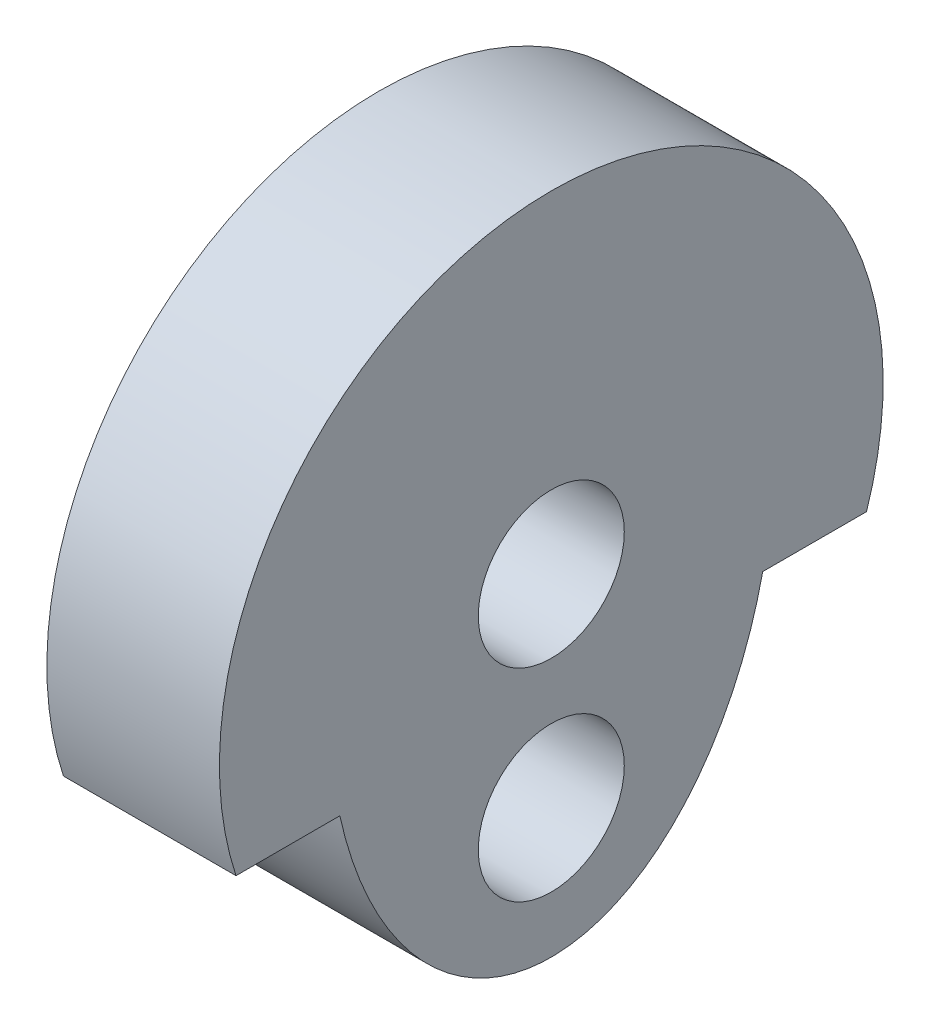
ISO-10303-21;
HEADER;
FILE_DESCRIPTION(('STEP AP214'),'2;1');
FILE_NAME('part.step','',(''),(''),'','','');
FILE_SCHEMA(('AUTOMOTIVE_DESIGN { 1 0 10303 214 1 1 1 1 }'));
ENDSEC;
DATA;
#1=APPLICATION_CONTEXT('core data for automotive mechanical design processes');
#2=APPLICATION_PROTOCOL_DEFINITION('international standard','automotive_design',2000,#1);
#3=PRODUCT_CONTEXT('',#1,'mechanical');
#4=PRODUCT('Part','Part','',(#3));
#5=PRODUCT_RELATED_PRODUCT_CATEGORY('part','',(#4));
#6=PRODUCT_DEFINITION_FORMATION('','',#4);
#7=PRODUCT_DEFINITION_CONTEXT('part definition',#1,'design');
#8=PRODUCT_DEFINITION('design','',#6,#7);
#9=PRODUCT_DEFINITION_SHAPE('','',#8);
#10=(LENGTH_UNIT() NAMED_UNIT(*) SI_UNIT(.MILLI.,.METRE.));
#11=(NAMED_UNIT(*) PLANE_ANGLE_UNIT() SI_UNIT($,.RADIAN.));
#12=(NAMED_UNIT(*) SI_UNIT($,.STERADIAN.) SOLID_ANGLE_UNIT());
#13=UNCERTAINTY_MEASURE_WITH_UNIT(LENGTH_MEASURE(1.E-05),#10,'distance_accuracy_value','');
#14=(GEOMETRIC_REPRESENTATION_CONTEXT(3) GLOBAL_UNCERTAINTY_ASSIGNED_CONTEXT((#13)) GLOBAL_UNIT_ASSIGNED_CONTEXT((#10,
#11,#12)) REPRESENTATION_CONTEXT('',''));
#15=CARTESIAN_POINT('',(0.,0.,0.));
#16=DIRECTION('',(0.,0.,1.));
#17=DIRECTION('',(1.,0.,0.));
#18=AXIS2_PLACEMENT_3D('',#15,#16,#17);
#19=CARTESIAN_POINT('',(13.,0.,0.));
#20=DIRECTION('',(1.,0.,0.));
#21=DIRECTION('',(0.,-1.,0.));
#22=AXIS2_PLACEMENT_3D('',#19,#20,#21);
#23=ELLIPSE('',#22,25.,16.7681810789173);
#24=DIRECTION('',(-1.,0.,0.));
#25=VECTOR('',#24,1.);
#26=SURFACE_OF_LINEAR_EXTRUSION('',#23,#25);
#27=CARTESIAN_POINT('',(0.,0.,0.));
#28=DIRECTION('',(1.,0.,0.));
#29=DIRECTION('',(0.,-1.,0.));
#30=AXIS2_PLACEMENT_3D('',#27,#28,#29);
#31=ELLIPSE('',#30,25.,16.7681810789173);
#32=CARTESIAN_POINT('',(0.,-7.80628379966867,15.9297640219795));
#33=VERTEX_POINT('',#32);
#34=CARTESIAN_POINT('',(0.,-7.80628379966867,-15.9297640219795));
#35=VERTEX_POINT('',#34);
#36=EDGE_CURVE('E107',#33,#35,#31,.T.);
#37=ORIENTED_EDGE('',*,*,#36,.T.);
#38=DIRECTION('',(-1.,0.,0.));
#39=VECTOR('',#38,1.);
#40=CARTESIAN_POINT('',(13.,-7.80628379966867,-15.9297640219795));
#41=LINE('',#40,#39);
#42=CARTESIAN_POINT('',(13.,-7.80628379966867,-15.9297640219795));
#43=VERTEX_POINT('',#42);
#44=EDGE_CURVE('E11',#43,#35,#41,.T.);
#45=ORIENTED_EDGE('',*,*,#44,.F.);
#46=CARTESIAN_POINT('',(13.,-7.80628379966867,15.9297640219795));
#47=VERTEX_POINT('',#46);
#48=EDGE_CURVE('E92',#47,#43,#23,.T.);
#49=ORIENTED_EDGE('',*,*,#48,.F.);
#50=DIRECTION('',(-1.,0.,0.));
#51=VECTOR('',#50,1.);
#52=CARTESIAN_POINT('',(13.,-7.80628379966867,15.9297640219795));
#53=LINE('',#52,#51);
#54=EDGE_CURVE('E104',#47,#33,#53,.T.);
#55=ORIENTED_EDGE('',*,*,#54,.T.);
#56=EDGE_LOOP('',(#37,#45,#49,#55));
#57=FACE_BOUND('',#56,.T.);
#58=ADVANCED_FACE('F39',(#57),#26,.F.);
#59=CARTESIAN_POINT('',(13.,-7.80628379966867,-15.9297640219795));
#60=DIRECTION('',(0.,1.,0.));
#61=DIRECTION('',(0.,0.,1.));
#62=AXIS2_PLACEMENT_3D('',#59,#60,#61);
#63=PLANE('',#62);
#64=DIRECTION('',(0.,0.,-1.));
#65=VECTOR('',#64,1.);
#66=CARTESIAN_POINT('',(0.,-7.80628379966867,-15.9297640219795));
#67=LINE('',#66,#65);
#68=CARTESIAN_POINT('',(0.,-7.80628379966867,-23.7499880681871));
#69=VERTEX_POINT('',#68);
#70=EDGE_CURVE('E97',#35,#69,#67,.T.);
#71=ORIENTED_EDGE('',*,*,#70,.T.);
#72=DIRECTION('',(-1.,0.,0.));
#73=VECTOR('',#72,1.);
#74=CARTESIAN_POINT('',(13.,-7.80628379966867,-23.7499880681871));
#75=LINE('',#74,#73);
#76=CARTESIAN_POINT('',(13.,-7.80628379966867,-23.7499880681871));
#77=VERTEX_POINT('',#76);
#78=EDGE_CURVE('E49',#77,#69,#75,.T.);
#79=ORIENTED_EDGE('',*,*,#78,.F.);
#80=DIRECTION('',(0.,0.,-1.));
#81=VECTOR('',#80,1.);
#82=CARTESIAN_POINT('',(13.,-7.80628379966867,-15.9297640219795));
#83=LINE('',#82,#81);
#84=EDGE_CURVE('E87',#43,#77,#83,.T.);
#85=ORIENTED_EDGE('',*,*,#84,.F.);
#86=ORIENTED_EDGE('',*,*,#44,.T.);
#87=EDGE_LOOP('',(#71,#79,#85,#86));
#88=FACE_BOUND('',#87,.T.);
#89=ADVANCED_FACE('F96',(#88),#63,.F.);
#90=CARTESIAN_POINT('',(13.,0.,0.));
#91=DIRECTION('',(-1.,0.,0.));
#92=DIRECTION('',(0.,0.,1.));
#93=AXIS2_PLACEMENT_3D('',#90,#91,#92);
#94=CYLINDRICAL_SURFACE('',#93,25.);
#95=CARTESIAN_POINT('',(0.,0.,0.));
#96=DIRECTION('',(1.,0.,0.));
#97=DIRECTION('',(0.,0.,-1.));
#98=AXIS2_PLACEMENT_3D('',#95,#96,#97);
#99=CIRCLE('',#98,25.);
#100=CARTESIAN_POINT('',(0.,-7.80628379966867,23.7499880681871));
#101=VERTEX_POINT('',#100);
#102=EDGE_CURVE('E74',#69,#101,#99,.T.);
#103=ORIENTED_EDGE('',*,*,#102,.T.);
#104=DIRECTION('',(-1.,0.,0.));
#105=VECTOR('',#104,1.);
#106=CARTESIAN_POINT('',(13.,-7.80628379966867,23.7499880681871));
#107=LINE('',#106,#105);
#108=CARTESIAN_POINT('',(13.,-7.80628379966867,23.7499880681871));
#109=VERTEX_POINT('',#108);
#110=EDGE_CURVE('E99',#109,#101,#107,.T.);
#111=ORIENTED_EDGE('',*,*,#110,.F.);
#112=CARTESIAN_POINT('',(13.,0.,0.));
#113=DIRECTION('',(1.,0.,0.));
#114=DIRECTION('',(0.,0.,-1.));
#115=AXIS2_PLACEMENT_3D('',#112,#113,#114);
#116=CIRCLE('',#115,25.);
#117=EDGE_CURVE('E90',#77,#109,#116,.T.);
#118=ORIENTED_EDGE('',*,*,#117,.F.);
#119=ORIENTED_EDGE('',*,*,#78,.T.);
#120=EDGE_LOOP('',(#103,#111,#118,#119));
#121=FACE_BOUND('',#120,.T.);
#122=ADVANCED_FACE('F100',(#121),#94,.T.);
#123=CARTESIAN_POINT('',(13.,-7.80628379966867,23.7499880681871));
#124=DIRECTION('',(0.,1.,0.));
#125=DIRECTION('',(0.,0.,1.));
#126=AXIS2_PLACEMENT_3D('',#123,#124,#125);
#127=PLANE('',#126);
#128=DIRECTION('',(0.,0.,-1.));
#129=VECTOR('',#128,1.);
#130=CARTESIAN_POINT('',(0.,-7.80628379966867,23.7499880681871));
#131=LINE('',#130,#129);
#132=EDGE_CURVE('E80',#101,#33,#131,.T.);
#133=ORIENTED_EDGE('',*,*,#132,.T.);
#134=ORIENTED_EDGE('',*,*,#54,.F.);
#135=DIRECTION('',(0.,0.,-1.));
#136=VECTOR('',#135,1.);
#137=CARTESIAN_POINT('',(13.,-7.80628379966867,23.7499880681871));
#138=LINE('',#137,#136);
#139=EDGE_CURVE('E57',#109,#47,#138,.T.);
#140=ORIENTED_EDGE('',*,*,#139,.F.);
#141=ORIENTED_EDGE('',*,*,#110,.T.);
#142=EDGE_LOOP('',(#133,#134,#140,#141));
#143=FACE_BOUND('',#142,.T.);
#144=ADVANCED_FACE('F121',(#143),#127,.F.);
#145=CARTESIAN_POINT('',(13.,0.,0.));
#146=DIRECTION('',(1.,0.,0.));
#147=DIRECTION('',(0.,0.,-1.));
#148=AXIS2_PLACEMENT_3D('',#145,#146,#147);
#149=PLANE('',#148);
#150=CARTESIAN_POINT('',(13.,-15.25,0.));
#151=DIRECTION('',(1.,0.,0.));
#152=DIRECTION('',(0.,0.,-1.));
#153=AXIS2_PLACEMENT_3D('',#150,#151,#152);
#154=CIRCLE('',#153,5.5);
#155=CARTESIAN_POINT('',(13.,-15.25,-5.5));
#156=VERTEX_POINT('',#155);
#157=EDGE_CURVE('E140',#156,#156,#154,.T.);
#158=ORIENTED_EDGE('',*,*,#157,.F.);
#159=EDGE_LOOP('',(#158));
#160=FACE_BOUND('',#159,.T.);
#161=CARTESIAN_POINT('',(13.,0.,0.));
#162=DIRECTION('',(1.,0.,0.));
#163=DIRECTION('',(0.,0.,-1.));
#164=AXIS2_PLACEMENT_3D('',#161,#162,#163);
#165=CIRCLE('',#164,5.5);
#166=CARTESIAN_POINT('',(13.,0.,-5.5));
#167=VERTEX_POINT('',#166);
#168=EDGE_CURVE('E132',#167,#167,#165,.T.);
#169=ORIENTED_EDGE('',*,*,#168,.F.);
#170=EDGE_LOOP('',(#169));
#171=FACE_BOUND('',#170,.T.);
#172=ORIENTED_EDGE('',*,*,#48,.T.);
#173=ORIENTED_EDGE('',*,*,#84,.T.);
#174=ORIENTED_EDGE('',*,*,#117,.T.);
#175=ORIENTED_EDGE('',*,*,#139,.T.);
#176=EDGE_LOOP('',(#172,#173,#174,#175));
#177=FACE_BOUND('',#176,.T.);
#178=ADVANCED_FACE('F88',(#160,#171,#177),#149,.T.);
#179=CARTESIAN_POINT('',(0.,0.,0.));
#180=DIRECTION('',(1.,0.,0.));
#181=DIRECTION('',(0.,0.,-1.));
#182=AXIS2_PLACEMENT_3D('',#179,#180,#181);
#183=PLANE('',#182);
#184=CARTESIAN_POINT('',(0.,-15.25,0.));
#185=DIRECTION('',(1.,0.,0.));
#186=DIRECTION('',(0.,0.,-1.));
#187=AXIS2_PLACEMENT_3D('',#184,#185,#186);
#188=CIRCLE('',#187,5.5);
#189=CARTESIAN_POINT('',(0.,-15.25,-5.5));
#190=VERTEX_POINT('',#189);
#191=EDGE_CURVE('E136',#190,#190,#188,.T.);
#192=ORIENTED_EDGE('',*,*,#191,.T.);
#193=EDGE_LOOP('',(#192));
#194=FACE_BOUND('',#193,.T.);
#195=CARTESIAN_POINT('',(0.,0.,0.));
#196=DIRECTION('',(1.,0.,0.));
#197=DIRECTION('',(0.,0.,-1.));
#198=AXIS2_PLACEMENT_3D('',#195,#196,#197);
#199=CIRCLE('',#198,5.5);
#200=CARTESIAN_POINT('',(0.,0.,-5.5));
#201=VERTEX_POINT('',#200);
#202=EDGE_CURVE('E111',#201,#201,#199,.T.);
#203=ORIENTED_EDGE('',*,*,#202,.T.);
#204=EDGE_LOOP('',(#203));
#205=FACE_BOUND('',#204,.T.);
#206=ORIENTED_EDGE('',*,*,#36,.F.);
#207=ORIENTED_EDGE('',*,*,#132,.F.);
#208=ORIENTED_EDGE('',*,*,#102,.F.);
#209=ORIENTED_EDGE('',*,*,#70,.F.);
#210=EDGE_LOOP('',(#206,#207,#208,#209));
#211=FACE_BOUND('',#210,.T.);
#212=ADVANCED_FACE('F124',(#194,#205,#211),#183,.F.);
#213=CARTESIAN_POINT('',(13.,0.,0.));
#214=DIRECTION('',(1.,0.,0.));
#215=DIRECTION('',(0.,0.,-1.));
#216=AXIS2_PLACEMENT_3D('',#213,#214,#215);
#217=CYLINDRICAL_SURFACE('',#216,5.5);
#218=ORIENTED_EDGE('',*,*,#202,.F.);
#219=EDGE_LOOP('',(#218));
#220=FACE_BOUND('',#219,.T.);
#221=ORIENTED_EDGE('',*,*,#168,.T.);
#222=EDGE_LOOP('',(#221));
#223=FACE_BOUND('',#222,.T.);
#224=ADVANCED_FACE('F152',(#220,#223),#217,.F.);
#225=CARTESIAN_POINT('',(13.,-15.25,0.));
#226=DIRECTION('',(1.,0.,0.));
#227=DIRECTION('',(0.,0.,-1.));
#228=AXIS2_PLACEMENT_3D('',#225,#226,#227);
#229=CYLINDRICAL_SURFACE('',#228,5.5);
#230=ORIENTED_EDGE('',*,*,#191,.F.);
#231=EDGE_LOOP('',(#230));
#232=FACE_BOUND('',#231,.T.);
#233=ORIENTED_EDGE('',*,*,#157,.T.);
#234=EDGE_LOOP('',(#233));
#235=FACE_BOUND('',#234,.T.);
#236=ADVANCED_FACE('F145',(#232,#235),#229,.F.);
#237=CLOSED_SHELL('',(#58,#89,#122,#144,#178,#212,#224,#236));
#238=MANIFOLD_SOLID_BREP('B2',#237);
#239=ADVANCED_BREP_SHAPE_REPRESENTATION('',(#18,#238),#14);
#240=SHAPE_DEFINITION_REPRESENTATION(#9,#239);
ENDSEC;
END-ISO-10303-21;
